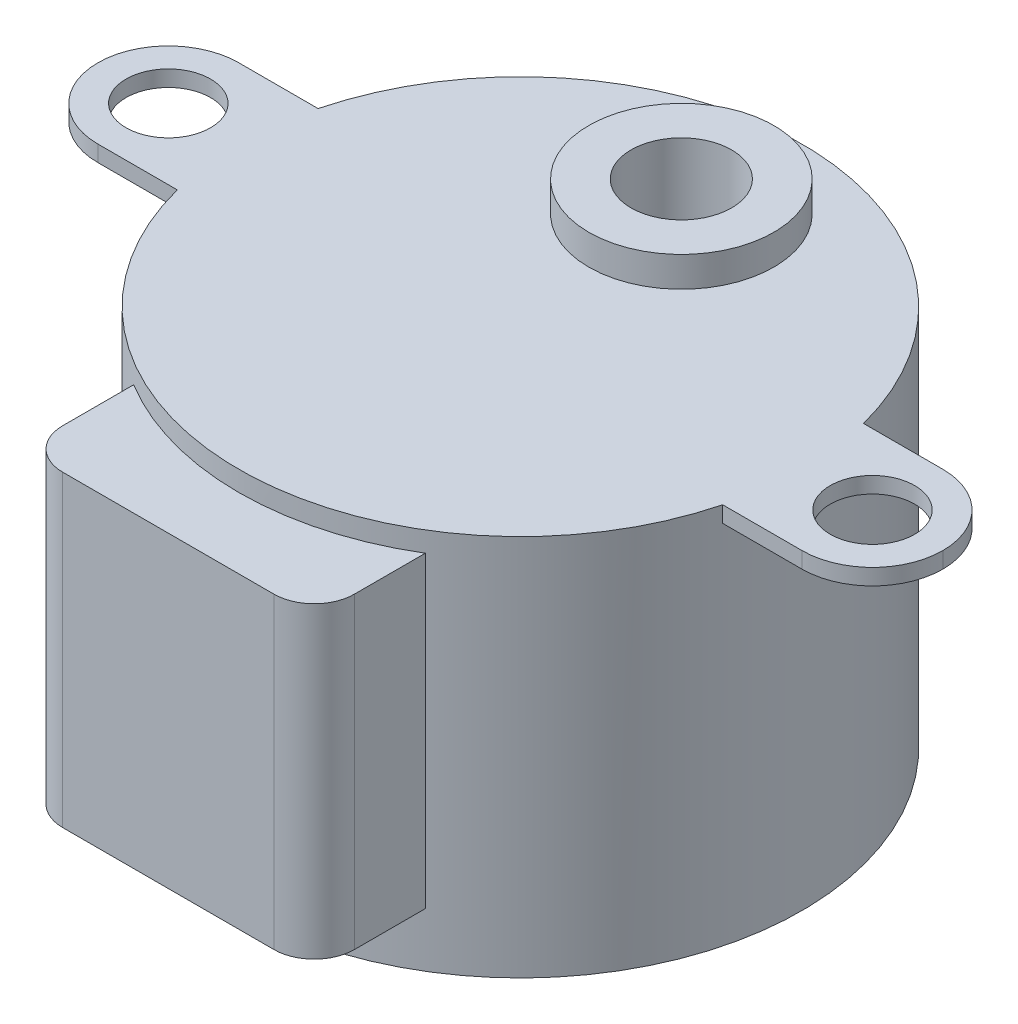
ISO-10303-21;
HEADER;
FILE_DESCRIPTION(('STEP AP214'),'2;1');
FILE_NAME('part.step','',(''),(''),'','','');
FILE_SCHEMA(('AUTOMOTIVE_DESIGN { 1 0 10303 214 1 1 1 1 }'));
ENDSEC;
DATA;
#1=APPLICATION_CONTEXT('core data for automotive mechanical design processes');
#2=APPLICATION_PROTOCOL_DEFINITION('international standard','automotive_design',2000,#1);
#3=PRODUCT_CONTEXT('',#1,'mechanical');
#4=PRODUCT('Part','Part','',(#3));
#5=PRODUCT_RELATED_PRODUCT_CATEGORY('part','',(#4));
#6=PRODUCT_DEFINITION_FORMATION('','',#4);
#7=PRODUCT_DEFINITION_CONTEXT('part definition',#1,'design');
#8=PRODUCT_DEFINITION('design','',#6,#7);
#9=PRODUCT_DEFINITION_SHAPE('','',#8);
#10=(LENGTH_UNIT() NAMED_UNIT(*) SI_UNIT(.MILLI.,.METRE.));
#11=(NAMED_UNIT(*) PLANE_ANGLE_UNIT() SI_UNIT($,.RADIAN.));
#12=(NAMED_UNIT(*) SI_UNIT($,.STERADIAN.) SOLID_ANGLE_UNIT());
#13=UNCERTAINTY_MEASURE_WITH_UNIT(LENGTH_MEASURE(1.E-05),#10,'distance_accuracy_value','');
#14=(GEOMETRIC_REPRESENTATION_CONTEXT(3) GLOBAL_UNCERTAINTY_ASSIGNED_CONTEXT((#13)) GLOBAL_UNIT_ASSIGNED_CONTEXT((#10,
#11,#12)) REPRESENTATION_CONTEXT('',''));
#15=CARTESIAN_POINT('',(0.,0.,0.));
#16=DIRECTION('',(0.,0.,1.));
#17=DIRECTION('',(1.,0.,0.));
#18=AXIS2_PLACEMENT_3D('',#15,#16,#17);
#19=CARTESIAN_POINT('',(-7.25,2.7,9.5));
#20=DIRECTION('',(-1.,0.,0.));
#21=DIRECTION('',(0.,0.,1.));
#22=AXIS2_PLACEMENT_3D('',#19,#20,#21);
#23=PLANE('',#22);
#24=DIRECTION('',(0.,1.,0.));
#25=VECTOR('',#24,1.);
#26=CARTESIAN_POINT('',(-7.25,2.7,15.5));
#27=LINE('',#26,#25);
#28=CARTESIAN_POINT('',(-7.25,2.7,15.5));
#29=VERTEX_POINT('',#28);
#30=CARTESIAN_POINT('',(-7.25,18.,15.5));
#31=VERTEX_POINT('',#30);
#32=EDGE_CURVE('E164',#29,#31,#27,.T.);
#33=ORIENTED_EDGE('',*,*,#32,.T.);
#34=DIRECTION('',(0.,0.,1.));
#35=VECTOR('',#34,1.);
#36=CARTESIAN_POINT('',(-7.25,18.,11.9765395670035));
#37=LINE('',#36,#35);
#38=CARTESIAN_POINT('',(-7.25,18.,11.9765395670035));
#39=VERTEX_POINT('',#38);
#40=EDGE_CURVE('E150',#39,#31,#37,.T.);
#41=ORIENTED_EDGE('',*,*,#40,.F.);
#42=DIRECTION('',(0.,-1.,0.));
#43=VECTOR('',#42,1.);
#44=CARTESIAN_POINT('',(-7.25,19.,11.9765395670035));
#45=LINE('',#44,#43);
#46=CARTESIAN_POINT('',(-7.25,2.7,11.9765395670035));
#47=VERTEX_POINT('',#46);
#48=EDGE_CURVE('E161',#47,#39,#45,.F.);
#49=ORIENTED_EDGE('',*,*,#48,.F.);
#50=DIRECTION('',(0.,0.,1.));
#51=VECTOR('',#50,1.);
#52=CARTESIAN_POINT('',(-7.25,2.7,9.5));
#53=LINE('',#52,#51);
#54=EDGE_CURVE('E269',#47,#29,#53,.T.);
#55=ORIENTED_EDGE('',*,*,#54,.T.);
#56=EDGE_LOOP('',(#33,#41,#49,#55));
#57=FACE_BOUND('',#56,.T.);
#58=ADVANCED_FACE('F36',(#57),#23,.T.);
#59=CARTESIAN_POINT('',(7.25,2.7,9.5));
#60=DIRECTION('',(1.,0.,0.));
#61=DIRECTION('',(0.,0.,-1.));
#62=AXIS2_PLACEMENT_3D('',#59,#60,#61);
#63=PLANE('',#62);
#64=DIRECTION('',(0.,-1.,0.));
#65=VECTOR('',#64,1.);
#66=CARTESIAN_POINT('',(7.25,19.,11.9765395670035));
#67=LINE('',#66,#65);
#68=CARTESIAN_POINT('',(7.25,18.,11.9765395670035));
#69=VERTEX_POINT('',#68);
#70=CARTESIAN_POINT('',(7.25,2.7,11.9765395670035));
#71=VERTEX_POINT('',#70);
#72=EDGE_CURVE('E172',#69,#71,#67,.T.);
#73=ORIENTED_EDGE('',*,*,#72,.F.);
#74=DIRECTION('',(0.,0.,-1.));
#75=VECTOR('',#74,1.);
#76=CARTESIAN_POINT('',(7.25,18.,22.1692249295966));
#77=LINE('',#76,#75);
#78=CARTESIAN_POINT('',(7.25,18.,15.5));
#79=VERTEX_POINT('',#78);
#80=EDGE_CURVE('E152',#79,#69,#77,.T.);
#81=ORIENTED_EDGE('',*,*,#80,.F.);
#82=DIRECTION('',(0.,1.,0.));
#83=VECTOR('',#82,1.);
#84=CARTESIAN_POINT('',(7.25,2.7,15.5));
#85=LINE('',#84,#83);
#86=CARTESIAN_POINT('',(7.25,2.7,15.5));
#87=VERTEX_POINT('',#86);
#88=EDGE_CURVE('E44',#79,#87,#85,.F.);
#89=ORIENTED_EDGE('',*,*,#88,.T.);
#90=DIRECTION('',(0.,0.,-1.));
#91=VECTOR('',#90,1.);
#92=CARTESIAN_POINT('',(7.25,2.7,9.5));
#93=LINE('',#92,#91);
#94=EDGE_CURVE('E177',#87,#71,#93,.T.);
#95=ORIENTED_EDGE('',*,*,#94,.T.);
#96=EDGE_LOOP('',(#73,#81,#89,#95));
#97=FACE_BOUND('',#96,.T.);
#98=ADVANCED_FACE('F287',(#97),#63,.T.);
#99=CARTESIAN_POINT('',(-7.25,2.7,17.5));
#100=DIRECTION('',(0.,0.,1.));
#101=DIRECTION('',(1.,0.,0.));
#102=AXIS2_PLACEMENT_3D('',#99,#100,#101);
#103=PLANE('',#102);
#104=DIRECTION('',(0.,1.,0.));
#105=VECTOR('',#104,1.);
#106=CARTESIAN_POINT('',(5.25,2.7,17.5));
#107=LINE('',#106,#105);
#108=CARTESIAN_POINT('',(5.25,2.7,17.5));
#109=VERTEX_POINT('',#108);
#110=CARTESIAN_POINT('',(5.25,18.,17.5));
#111=VERTEX_POINT('',#110);
#112=EDGE_CURVE('E257',#109,#111,#107,.T.);
#113=ORIENTED_EDGE('',*,*,#112,.T.);
#114=DIRECTION('',(-1.,0.,0.));
#115=VECTOR('',#114,1.);
#116=CARTESIAN_POINT('',(-7.25,18.,17.5));
#117=LINE('',#116,#115);
#118=CARTESIAN_POINT('',(-5.25,18.,17.5));
#119=VERTEX_POINT('',#118);
#120=EDGE_CURVE('E51',#111,#119,#117,.T.);
#121=ORIENTED_EDGE('',*,*,#120,.T.);
#122=DIRECTION('',(0.,1.,0.));
#123=VECTOR('',#122,1.);
#124=CARTESIAN_POINT('',(-5.25,2.7,17.5));
#125=LINE('',#124,#123);
#126=CARTESIAN_POINT('',(-5.25,2.7,17.5));
#127=VERTEX_POINT('',#126);
#128=EDGE_CURVE('E260',#119,#127,#125,.F.);
#129=ORIENTED_EDGE('',*,*,#128,.T.);
#130=DIRECTION('',(1.,0.,0.));
#131=VECTOR('',#130,1.);
#132=CARTESIAN_POINT('',(-7.25,2.7,17.5));
#133=LINE('',#132,#131);
#134=EDGE_CURVE('E271',#127,#109,#133,.T.);
#135=ORIENTED_EDGE('',*,*,#134,.T.);
#136=EDGE_LOOP('',(#113,#121,#129,#135));
#137=FACE_BOUND('',#136,.T.);
#138=ADVANCED_FACE('F292',(#137),#103,.T.);
#139=CARTESIAN_POINT('',(-5.25,2.7,15.5));
#140=DIRECTION('',(0.,1.,0.));
#141=DIRECTION('',(0.,0.,1.));
#142=AXIS2_PLACEMENT_3D('',#139,#140,#141);
#143=CYLINDRICAL_SURFACE('',#142,2.);
#144=ORIENTED_EDGE('',*,*,#128,.F.);
#145=CARTESIAN_POINT('',(-5.25,18.,15.5));
#146=DIRECTION('',(0.,1.,0.));
#147=DIRECTION('',(0.,0.,1.));
#148=AXIS2_PLACEMENT_3D('',#145,#146,#147);
#149=CIRCLE('',#148,2.);
#150=EDGE_CURVE('E277',#119,#31,#149,.F.);
#151=ORIENTED_EDGE('',*,*,#150,.T.);
#152=ORIENTED_EDGE('',*,*,#32,.F.);
#153=CARTESIAN_POINT('',(-5.25,2.7,15.5));
#154=DIRECTION('',(0.,1.,0.));
#155=DIRECTION('',(0.,0.,1.));
#156=AXIS2_PLACEMENT_3D('',#153,#154,#155);
#157=CIRCLE('',#156,2.);
#158=EDGE_CURVE('E264',#127,#29,#157,.F.);
#159=ORIENTED_EDGE('',*,*,#158,.F.);
#160=EDGE_LOOP('',(#144,#151,#152,#159));
#161=FACE_BOUND('',#160,.T.);
#162=ADVANCED_FACE('F276',(#161),#143,.T.);
#163=CARTESIAN_POINT('',(5.25,2.7,15.5));
#164=DIRECTION('',(0.,1.,0.));
#165=DIRECTION('',(0.,0.,1.));
#166=AXIS2_PLACEMENT_3D('',#163,#164,#165);
#167=CYLINDRICAL_SURFACE('',#166,2.);
#168=ORIENTED_EDGE('',*,*,#88,.F.);
#169=CARTESIAN_POINT('',(5.25,18.,15.5));
#170=DIRECTION('',(0.,1.,0.));
#171=DIRECTION('',(0.,0.,1.));
#172=AXIS2_PLACEMENT_3D('',#169,#170,#171);
#173=CIRCLE('',#172,2.);
#174=EDGE_CURVE('E11',#79,#111,#173,.F.);
#175=ORIENTED_EDGE('',*,*,#174,.T.);
#176=ORIENTED_EDGE('',*,*,#112,.F.);
#177=CARTESIAN_POINT('',(5.25,2.7,15.5));
#178=DIRECTION('',(0.,1.,0.));
#179=DIRECTION('',(0.,0.,1.));
#180=AXIS2_PLACEMENT_3D('',#177,#178,#179);
#181=CIRCLE('',#180,2.);
#182=EDGE_CURVE('E262',#87,#109,#181,.F.);
#183=ORIENTED_EDGE('',*,*,#182,.F.);
#184=EDGE_LOOP('',(#168,#175,#176,#183));
#185=FACE_BOUND('',#184,.T.);
#186=ADVANCED_FACE('F38',(#185),#167,.T.);
#187=CARTESIAN_POINT('',(0.,20.5,-8.));
#188=DIRECTION('',(0.,1.,0.));
#189=DIRECTION('',(0.,0.,1.));
#190=AXIS2_PLACEMENT_3D('',#187,#188,#189);
#191=PLANE('',#190);
#192=CARTESIAN_POINT('',(0.,20.5,-8.));
#193=DIRECTION('',(0.,1.,0.));
#194=DIRECTION('',(0.,0.,1.));
#195=AXIS2_PLACEMENT_3D('',#192,#193,#194);
#196=CIRCLE('',#195,4.6);
#197=CARTESIAN_POINT('',(0.,20.5,-3.4));
#198=VERTEX_POINT('',#197);
#199=EDGE_CURVE('E274',#198,#198,#196,.T.);
#200=ORIENTED_EDGE('',*,*,#199,.T.);
#201=EDGE_LOOP('',(#200));
#202=FACE_BOUND('',#201,.T.);
#203=CARTESIAN_POINT('',(0.,20.5,-8.));
#204=DIRECTION('',(0.,1.,0.));
#205=DIRECTION('',(0.,0.,1.));
#206=AXIS2_PLACEMENT_3D('',#203,#204,#205);
#207=CIRCLE('',#206,2.5);
#208=CARTESIAN_POINT('',(0.,20.5,-5.5));
#209=VERTEX_POINT('',#208);
#210=EDGE_CURVE('E156',#209,#209,#207,.T.);
#211=ORIENTED_EDGE('',*,*,#210,.F.);
#212=EDGE_LOOP('',(#211));
#213=FACE_BOUND('',#212,.T.);
#214=ADVANCED_FACE('F334',(#202,#213),#191,.T.);
#215=CARTESIAN_POINT('',(0.,19.,0.));
#216=DIRECTION('',(0.,1.,0.));
#217=DIRECTION('',(0.,0.,1.));
#218=AXIS2_PLACEMENT_3D('',#215,#216,#217);
#219=PLANE('',#218);
#220=CARTESIAN_POINT('',(0.,19.,0.));
#221=DIRECTION('',(0.,1.,0.));
#222=DIRECTION('',(0.,0.,1.));
#223=AXIS2_PLACEMENT_3D('',#220,#221,#222);
#224=CIRCLE('',#223,14.);
#225=CARTESIAN_POINT('',(-13.555441711726,19.,3.5));
#226=VERTEX_POINT('',#225);
#227=CARTESIAN_POINT('',(13.5554417117259,19.,3.5));
#228=VERTEX_POINT('',#227);
#229=EDGE_CURVE('E218',#226,#228,#224,.T.);
#230=ORIENTED_EDGE('',*,*,#229,.T.);
#231=DIRECTION('',(1.,0.,0.));
#232=VECTOR('',#231,1.);
#233=CARTESIAN_POINT('',(-21.,19.,3.5));
#234=LINE('',#233,#232);
#235=CARTESIAN_POINT('',(17.5,19.,3.5));
#236=VERTEX_POINT('',#235);
#237=EDGE_CURVE('E191',#228,#236,#234,.T.);
#238=ORIENTED_EDGE('',*,*,#237,.T.);
#239=CARTESIAN_POINT('',(17.5,19.,0.));
#240=DIRECTION('',(0.,1.,0.));
#241=DIRECTION('',(0.,0.,1.));
#242=AXIS2_PLACEMENT_3D('',#239,#240,#241);
#243=CIRCLE('',#242,3.5);
#244=CARTESIAN_POINT('',(21.,19.,0.));
#245=VERTEX_POINT('',#244);
#246=EDGE_CURVE('E236',#236,#245,#243,.T.);
#247=ORIENTED_EDGE('',*,*,#246,.T.);
#248=CARTESIAN_POINT('',(17.5,19.,0.));
#249=DIRECTION('',(0.,1.,0.));
#250=DIRECTION('',(0.,0.,1.));
#251=AXIS2_PLACEMENT_3D('',#248,#249,#250);
#252=CIRCLE('',#251,3.5);
#253=CARTESIAN_POINT('',(17.5,19.,-3.5));
#254=VERTEX_POINT('',#253);
#255=EDGE_CURVE('E234',#245,#254,#252,.T.);
#256=ORIENTED_EDGE('',*,*,#255,.T.);
#257=DIRECTION('',(-1.,0.,0.));
#258=VECTOR('',#257,1.);
#259=CARTESIAN_POINT('',(-21.,19.,-3.5));
#260=LINE('',#259,#258);
#261=CARTESIAN_POINT('',(13.555441711726,19.,-3.5));
#262=VERTEX_POINT('',#261);
#263=EDGE_CURVE('E204',#254,#262,#260,.T.);
#264=ORIENTED_EDGE('',*,*,#263,.T.);
#265=CARTESIAN_POINT('',(-13.555441711726,19.,-3.5));
#266=VERTEX_POINT('',#265);
#267=EDGE_CURVE('E220',#262,#266,#224,.T.);
#268=ORIENTED_EDGE('',*,*,#267,.T.);
#269=CARTESIAN_POINT('',(-17.5,19.,-3.5));
#270=VERTEX_POINT('',#269);
#271=EDGE_CURVE('E203',#266,#270,#260,.T.);
#272=ORIENTED_EDGE('',*,*,#271,.T.);
#273=CARTESIAN_POINT('',(-17.5,19.,0.));
#274=DIRECTION('',(0.,1.,0.));
#275=DIRECTION('',(0.,0.,1.));
#276=AXIS2_PLACEMENT_3D('',#273,#274,#275);
#277=CIRCLE('',#276,3.5);
#278=CARTESIAN_POINT('',(-21.,19.,0.));
#279=VERTEX_POINT('',#278);
#280=EDGE_CURVE('E230',#270,#279,#277,.T.);
#281=ORIENTED_EDGE('',*,*,#280,.T.);
#282=CARTESIAN_POINT('',(-17.5,19.,0.));
#283=DIRECTION('',(0.,1.,0.));
#284=DIRECTION('',(0.,0.,1.));
#285=AXIS2_PLACEMENT_3D('',#282,#283,#284);
#286=CIRCLE('',#285,3.5);
#287=CARTESIAN_POINT('',(-17.5,19.,3.5));
#288=VERTEX_POINT('',#287);
#289=EDGE_CURVE('E232',#279,#288,#286,.T.);
#290=ORIENTED_EDGE('',*,*,#289,.T.);
#291=EDGE_CURVE('E201',#288,#226,#234,.T.);
#292=ORIENTED_EDGE('',*,*,#291,.T.);
#293=EDGE_LOOP('',(#230,#238,#247,#256,#264,#268,#272,#281,#290,#292));
#294=FACE_BOUND('',#293,.T.);
#295=CARTESIAN_POINT('',(17.5,19.,0.));
#296=DIRECTION('',(0.,1.,0.));
#297=DIRECTION('',(0.,0.,1.));
#298=AXIS2_PLACEMENT_3D('',#295,#296,#297);
#299=CIRCLE('',#298,2.1);
#300=CARTESIAN_POINT('',(17.5,19.,2.1));
#301=VERTEX_POINT('',#300);
#302=EDGE_CURVE('E185',#301,#301,#299,.T.);
#303=ORIENTED_EDGE('',*,*,#302,.F.);
#304=EDGE_LOOP('',(#303));
#305=FACE_BOUND('',#304,.T.);
#306=CARTESIAN_POINT('',(-17.5,19.,0.));
#307=DIRECTION('',(0.,1.,0.));
#308=DIRECTION('',(0.,0.,1.));
#309=AXIS2_PLACEMENT_3D('',#306,#307,#308);
#310=CIRCLE('',#309,2.1);
#311=CARTESIAN_POINT('',(-17.5,19.,2.1));
#312=VERTEX_POINT('',#311);
#313=EDGE_CURVE('E184',#312,#312,#310,.T.);
#314=ORIENTED_EDGE('',*,*,#313,.F.);
#315=EDGE_LOOP('',(#314));
#316=FACE_BOUND('',#315,.T.);
#317=CARTESIAN_POINT('',(0.,19.,-8.));
#318=DIRECTION('',(0.,1.,0.));
#319=DIRECTION('',(0.,0.,1.));
#320=AXIS2_PLACEMENT_3D('',#317,#318,#319);
#321=CIRCLE('',#320,4.6);
#322=CARTESIAN_POINT('',(0.,19.,-3.4));
#323=VERTEX_POINT('',#322);
#324=EDGE_CURVE('E278',#323,#323,#321,.T.);
#325=ORIENTED_EDGE('',*,*,#324,.F.);
#326=EDGE_LOOP('',(#325));
#327=FACE_BOUND('',#326,.T.);
#328=ADVANCED_FACE('F331',(#294,#305,#316,#327),#219,.T.);
#329=CARTESIAN_POINT('',(0.,19.,0.));
#330=DIRECTION('',(0.,-1.,0.));
#331=DIRECTION('',(0.,0.,-1.));
#332=AXIS2_PLACEMENT_3D('',#329,#330,#331);
#333=CYLINDRICAL_SURFACE('',#332,14.);
#334=DIRECTION('',(0.,-1.,0.));
#335=VECTOR('',#334,1.);
#336=CARTESIAN_POINT('',(13.555441711726,19.,3.5));
#337=LINE('',#336,#335);
#338=CARTESIAN_POINT('',(13.555441711726,18.2,3.5));
#339=VERTEX_POINT('',#338);
#340=EDGE_CURVE('E200',#339,#228,#337,.F.);
#341=ORIENTED_EDGE('',*,*,#340,.T.);
#342=ORIENTED_EDGE('',*,*,#229,.F.);
#343=DIRECTION('',(0.,-1.,0.));
#344=VECTOR('',#343,1.);
#345=CARTESIAN_POINT('',(-13.555441711726,19.,3.5));
#346=LINE('',#345,#344);
#347=CARTESIAN_POINT('',(-13.555441711726,18.2,3.5));
#348=VERTEX_POINT('',#347);
#349=EDGE_CURVE('E208',#226,#348,#346,.T.);
#350=ORIENTED_EDGE('',*,*,#349,.T.);
#351=CARTESIAN_POINT('',(0.,18.2,0.));
#352=DIRECTION('',(0.,1.,0.));
#353=DIRECTION('',(0.,0.,1.));
#354=AXIS2_PLACEMENT_3D('',#351,#352,#353);
#355=CIRCLE('',#354,14.);
#356=CARTESIAN_POINT('',(-13.555441711726,18.2,-3.5));
#357=VERTEX_POINT('',#356);
#358=EDGE_CURVE('E223',#357,#348,#355,.T.);
#359=ORIENTED_EDGE('',*,*,#358,.F.);
#360=DIRECTION('',(0.,-1.,0.));
#361=VECTOR('',#360,1.);
#362=CARTESIAN_POINT('',(-13.555441711726,19.,-3.5));
#363=LINE('',#362,#361);
#364=EDGE_CURVE('E211',#357,#266,#363,.F.);
#365=ORIENTED_EDGE('',*,*,#364,.T.);
#366=ORIENTED_EDGE('',*,*,#267,.F.);
#367=DIRECTION('',(0.,-1.,0.));
#368=VECTOR('',#367,1.);
#369=CARTESIAN_POINT('',(13.555441711726,19.,-3.5));
#370=LINE('',#369,#368);
#371=CARTESIAN_POINT('',(13.555441711726,18.2,-3.5));
#372=VERTEX_POINT('',#371);
#373=EDGE_CURVE('E214',#262,#372,#370,.T.);
#374=ORIENTED_EDGE('',*,*,#373,.T.);
#375=EDGE_CURVE('E226',#339,#372,#355,.T.);
#376=ORIENTED_EDGE('',*,*,#375,.F.);
#377=EDGE_LOOP('',(#341,#342,#350,#359,#365,#366,#374,#376));
#378=FACE_BOUND('',#377,.T.);
#379=CARTESIAN_POINT('',(0.,2.7,0.));
#380=DIRECTION('',(0.,1.,0.));
#381=DIRECTION('',(0.,0.,1.));
#382=AXIS2_PLACEMENT_3D('',#379,#380,#381);
#383=CIRCLE('',#382,14.);
#384=EDGE_CURVE('E170',#47,#71,#383,.T.);
#385=ORIENTED_EDGE('',*,*,#384,.F.);
#386=ORIENTED_EDGE('',*,*,#48,.T.);
#387=CARTESIAN_POINT('',(0.,18.,0.));
#388=DIRECTION('',(0.,-1.,0.));
#389=DIRECTION('',(0.,0.,1.));
#390=AXIS2_PLACEMENT_3D('',#387,#388,#389);
#391=CIRCLE('',#390,14.);
#392=EDGE_CURVE('E147',#69,#39,#391,.T.);
#393=ORIENTED_EDGE('',*,*,#392,.F.);
#394=ORIENTED_EDGE('',*,*,#72,.T.);
#395=EDGE_LOOP('',(#385,#386,#393,#394));
#396=FACE_BOUND('',#395,.T.);
#397=CARTESIAN_POINT('',(0.,0.,0.));
#398=DIRECTION('',(0.,1.,0.));
#399=DIRECTION('',(0.,0.,1.));
#400=AXIS2_PLACEMENT_3D('',#397,#398,#399);
#401=CIRCLE('',#400,14.);
#402=CARTESIAN_POINT('',(0.,0.,14.));
#403=VERTEX_POINT('',#402);
#404=EDGE_CURVE('E217',#403,#403,#401,.T.);
#405=ORIENTED_EDGE('',*,*,#404,.T.);
#406=EDGE_LOOP('',(#405));
#407=FACE_BOUND('',#406,.T.);
#408=ADVANCED_FACE('F167',(#378,#396,#407),#333,.T.);
#409=CARTESIAN_POINT('',(0.,0.,0.));
#410=DIRECTION('',(0.,1.,0.));
#411=DIRECTION('',(0.,0.,1.));
#412=AXIS2_PLACEMENT_3D('',#409,#410,#411);
#413=PLANE('',#412);
#414=ORIENTED_EDGE('',*,*,#404,.F.);
#415=EDGE_LOOP('',(#414));
#416=FACE_BOUND('',#415,.T.);
#417=ADVANCED_FACE('F316',(#416),#413,.F.);
#418=CARTESIAN_POINT('',(-17.5,18.2,0.));
#419=DIRECTION('',(0.,1.,0.));
#420=DIRECTION('',(0.,0.,1.));
#421=AXIS2_PLACEMENT_3D('',#418,#419,#420);
#422=CYLINDRICAL_SURFACE('',#421,2.1);
#423=CARTESIAN_POINT('',(-17.5,18.2,0.));
#424=DIRECTION('',(0.,1.,0.));
#425=DIRECTION('',(0.,0.,1.));
#426=AXIS2_PLACEMENT_3D('',#423,#424,#425);
#427=CIRCLE('',#426,2.1);
#428=CARTESIAN_POINT('',(-17.5,18.2,2.1));
#429=VERTEX_POINT('',#428);
#430=EDGE_CURVE('E188',#429,#429,#427,.T.);
#431=ORIENTED_EDGE('',*,*,#430,.F.);
#432=EDGE_LOOP('',(#431));
#433=FACE_BOUND('',#432,.T.);
#434=ORIENTED_EDGE('',*,*,#313,.T.);
#435=EDGE_LOOP('',(#434));
#436=FACE_BOUND('',#435,.T.);
#437=ADVANCED_FACE('F312',(#433,#436),#422,.F.);
#438=CARTESIAN_POINT('',(0.,18.2,0.));
#439=DIRECTION('',(0.,1.,0.));
#440=DIRECTION('',(0.,0.,1.));
#441=AXIS2_PLACEMENT_3D('',#438,#439,#440);
#442=PLANE('',#441);
#443=ORIENTED_EDGE('',*,*,#430,.T.);
#444=EDGE_LOOP('',(#443));
#445=FACE_BOUND('',#444,.T.);
#446=DIRECTION('',(1.,0.,0.));
#447=VECTOR('',#446,1.);
#448=CARTESIAN_POINT('',(-21.,18.2,3.5));
#449=LINE('',#448,#447);
#450=CARTESIAN_POINT('',(-17.5,18.2,3.5));
#451=VERTEX_POINT('',#450);
#452=EDGE_CURVE('E194',#451,#348,#449,.T.);
#453=ORIENTED_EDGE('',*,*,#452,.F.);
#454=CARTESIAN_POINT('',(-17.5,18.2,0.));
#455=DIRECTION('',(0.,1.,0.));
#456=DIRECTION('',(0.,0.,1.));
#457=AXIS2_PLACEMENT_3D('',#454,#455,#456);
#458=CIRCLE('',#457,3.5);
#459=CARTESIAN_POINT('',(-21.,18.2,0.));
#460=VERTEX_POINT('',#459);
#461=EDGE_CURVE('E249',#451,#460,#458,.F.);
#462=ORIENTED_EDGE('',*,*,#461,.T.);
#463=CARTESIAN_POINT('',(-17.5,18.2,0.));
#464=DIRECTION('',(0.,1.,0.));
#465=DIRECTION('',(0.,0.,1.));
#466=AXIS2_PLACEMENT_3D('',#463,#464,#465);
#467=CIRCLE('',#466,3.5);
#468=CARTESIAN_POINT('',(-17.5,18.2,-3.5));
#469=VERTEX_POINT('',#468);
#470=EDGE_CURVE('E247',#460,#469,#467,.F.);
#471=ORIENTED_EDGE('',*,*,#470,.T.);
#472=DIRECTION('',(-1.,0.,0.));
#473=VECTOR('',#472,1.);
#474=CARTESIAN_POINT('',(-21.,18.2,-3.5));
#475=LINE('',#474,#473);
#476=EDGE_CURVE('E196',#357,#469,#475,.T.);
#477=ORIENTED_EDGE('',*,*,#476,.F.);
#478=ORIENTED_EDGE('',*,*,#358,.T.);
#479=EDGE_LOOP('',(#453,#462,#471,#477,#478));
#480=FACE_BOUND('',#479,.T.);
#481=ADVANCED_FACE('F315',(#445,#480),#442,.F.);
#482=CARTESIAN_POINT('',(-21.,18.2,3.5));
#483=DIRECTION('',(0.,0.,1.));
#484=DIRECTION('',(1.,0.,0.));
#485=AXIS2_PLACEMENT_3D('',#482,#483,#484);
#486=PLANE('',#485);
#487=ORIENTED_EDGE('',*,*,#291,.F.);
#488=DIRECTION('',(0.,1.,0.));
#489=VECTOR('',#488,1.);
#490=CARTESIAN_POINT('',(-17.5,18.2,3.5));
#491=LINE('',#490,#489);
#492=EDGE_CURVE('E244',#288,#451,#491,.F.);
#493=ORIENTED_EDGE('',*,*,#492,.T.);
#494=ORIENTED_EDGE('',*,*,#452,.T.);
#495=ORIENTED_EDGE('',*,*,#349,.F.);
#496=EDGE_LOOP('',(#487,#493,#494,#495));
#497=FACE_BOUND('',#496,.T.);
#498=ADVANCED_FACE('F327',(#497),#486,.T.);
#499=CARTESIAN_POINT('',(-21.,18.2,-3.5));
#500=DIRECTION('',(0.,0.,-1.));
#501=DIRECTION('',(-1.,0.,0.));
#502=AXIS2_PLACEMENT_3D('',#499,#500,#501);
#503=PLANE('',#502);
#504=ORIENTED_EDGE('',*,*,#476,.T.);
#505=DIRECTION('',(0.,1.,0.));
#506=VECTOR('',#505,1.);
#507=CARTESIAN_POINT('',(-17.5,18.2,-3.5));
#508=LINE('',#507,#506);
#509=EDGE_CURVE('E251',#469,#270,#508,.T.);
#510=ORIENTED_EDGE('',*,*,#509,.T.);
#511=ORIENTED_EDGE('',*,*,#271,.F.);
#512=ORIENTED_EDGE('',*,*,#364,.F.);
#513=EDGE_LOOP('',(#504,#510,#511,#512));
#514=FACE_BOUND('',#513,.T.);
#515=ADVANCED_FACE('F322',(#514),#503,.T.);
#516=CARTESIAN_POINT('',(17.5,18.2,0.));
#517=DIRECTION('',(0.,1.,0.));
#518=DIRECTION('',(0.,0.,1.));
#519=AXIS2_PLACEMENT_3D('',#516,#517,#518);
#520=CIRCLE('',#519,2.1);
#521=CARTESIAN_POINT('',(17.5,18.2,2.1));
#522=VERTEX_POINT('',#521);
#523=EDGE_CURVE('E181',#522,#522,#520,.T.);
#524=ORIENTED_EDGE('',*,*,#523,.T.);
#525=EDGE_LOOP('',(#524));
#526=FACE_BOUND('',#525,.T.);
#527=CARTESIAN_POINT('',(17.5,18.2,0.));
#528=DIRECTION('',(0.,1.,0.));
#529=DIRECTION('',(0.,0.,1.));
#530=AXIS2_PLACEMENT_3D('',#527,#528,#529);
#531=CIRCLE('',#530,3.5);
#532=CARTESIAN_POINT('',(17.5,18.2,-3.5));
#533=VERTEX_POINT('',#532);
#534=CARTESIAN_POINT('',(21.,18.2,0.));
#535=VERTEX_POINT('',#534);
#536=EDGE_CURVE('E238',#533,#535,#531,.F.);
#537=ORIENTED_EDGE('',*,*,#536,.T.);
#538=CARTESIAN_POINT('',(17.5,18.2,0.));
#539=DIRECTION('',(0.,1.,0.));
#540=DIRECTION('',(0.,0.,1.));
#541=AXIS2_PLACEMENT_3D('',#538,#539,#540);
#542=CIRCLE('',#541,3.5);
#543=CARTESIAN_POINT('',(17.5,18.2,3.5));
#544=VERTEX_POINT('',#543);
#545=EDGE_CURVE('E240',#535,#544,#542,.F.);
#546=ORIENTED_EDGE('',*,*,#545,.T.);
#547=EDGE_CURVE('E197',#339,#544,#449,.T.);
#548=ORIENTED_EDGE('',*,*,#547,.F.);
#549=ORIENTED_EDGE('',*,*,#375,.T.);
#550=EDGE_CURVE('E198',#533,#372,#475,.T.);
#551=ORIENTED_EDGE('',*,*,#550,.F.);
#552=EDGE_LOOP('',(#537,#546,#548,#549,#551));
#553=FACE_BOUND('',#552,.T.);
#554=ADVANCED_FACE('F318',(#526,#553),#442,.F.);
#555=ORIENTED_EDGE('',*,*,#263,.F.);
#556=DIRECTION('',(0.,1.,0.));
#557=VECTOR('',#556,1.);
#558=CARTESIAN_POINT('',(17.5,18.2,-3.5));
#559=LINE('',#558,#557);
#560=EDGE_CURVE('E242',#254,#533,#559,.F.);
#561=ORIENTED_EDGE('',*,*,#560,.T.);
#562=ORIENTED_EDGE('',*,*,#550,.T.);
#563=ORIENTED_EDGE('',*,*,#373,.F.);
#564=EDGE_LOOP('',(#555,#561,#562,#563));
#565=FACE_BOUND('',#564,.T.);
#566=ADVANCED_FACE('F321',(#565),#503,.T.);
#567=ORIENTED_EDGE('',*,*,#547,.T.);
#568=DIRECTION('',(0.,1.,0.));
#569=VECTOR('',#568,1.);
#570=CARTESIAN_POINT('',(17.5,18.2,3.5));
#571=LINE('',#570,#569);
#572=EDGE_CURVE('E227',#544,#236,#571,.T.);
#573=ORIENTED_EDGE('',*,*,#572,.T.);
#574=ORIENTED_EDGE('',*,*,#237,.F.);
#575=ORIENTED_EDGE('',*,*,#340,.F.);
#576=EDGE_LOOP('',(#567,#573,#574,#575));
#577=FACE_BOUND('',#576,.T.);
#578=ADVANCED_FACE('F310',(#577),#486,.T.);
#579=CARTESIAN_POINT('',(17.5,18.2,0.));
#580=DIRECTION('',(0.,1.,0.));
#581=DIRECTION('',(0.,0.,1.));
#582=AXIS2_PLACEMENT_3D('',#579,#580,#581);
#583=CYLINDRICAL_SURFACE('',#582,2.1);
#584=ORIENTED_EDGE('',*,*,#523,.F.);
#585=EDGE_LOOP('',(#584));
#586=FACE_BOUND('',#585,.T.);
#587=ORIENTED_EDGE('',*,*,#302,.T.);
#588=EDGE_LOOP('',(#587));
#589=FACE_BOUND('',#588,.T.);
#590=ADVANCED_FACE('F306',(#586,#589),#583,.F.);
#591=CARTESIAN_POINT('',(17.5,18.2,0.));
#592=DIRECTION('',(0.,1.,0.));
#593=DIRECTION('',(0.,0.,1.));
#594=AXIS2_PLACEMENT_3D('',#591,#592,#593);
#595=CYLINDRICAL_SURFACE('',#594,3.5);
#596=DIRECTION('',(0.,1.,0.));
#597=VECTOR('',#596,1.);
#598=CARTESIAN_POINT('',(21.,18.2,0.));
#599=LINE('',#598,#597);
#600=EDGE_CURVE('E175',#535,#245,#599,.T.);
#601=ORIENTED_EDGE('',*,*,#600,.F.);
#602=ORIENTED_EDGE('',*,*,#536,.F.);
#603=ORIENTED_EDGE('',*,*,#560,.F.);
#604=ORIENTED_EDGE('',*,*,#255,.F.);
#605=EDGE_LOOP('',(#601,#602,#603,#604));
#606=FACE_BOUND('',#605,.T.);
#607=ADVANCED_FACE('F309',(#606),#595,.T.);
#608=CARTESIAN_POINT('',(17.5,18.2,0.));
#609=DIRECTION('',(0.,1.,0.));
#610=DIRECTION('',(0.,0.,1.));
#611=AXIS2_PLACEMENT_3D('',#608,#609,#610);
#612=CYLINDRICAL_SURFACE('',#611,3.5);
#613=ORIENTED_EDGE('',*,*,#545,.F.);
#614=ORIENTED_EDGE('',*,*,#600,.T.);
#615=ORIENTED_EDGE('',*,*,#246,.F.);
#616=ORIENTED_EDGE('',*,*,#572,.F.);
#617=EDGE_LOOP('',(#613,#614,#615,#616));
#618=FACE_BOUND('',#617,.T.);
#619=ADVANCED_FACE('F342',(#618),#612,.T.);
#620=CARTESIAN_POINT('',(-17.5,18.2,0.));
#621=DIRECTION('',(0.,1.,0.));
#622=DIRECTION('',(0.,0.,1.));
#623=AXIS2_PLACEMENT_3D('',#620,#621,#622);
#624=CYLINDRICAL_SURFACE('',#623,3.5);
#625=ORIENTED_EDGE('',*,*,#509,.F.);
#626=ORIENTED_EDGE('',*,*,#470,.F.);
#627=DIRECTION('',(0.,1.,0.));
#628=VECTOR('',#627,1.);
#629=CARTESIAN_POINT('',(-21.,18.2,0.));
#630=LINE('',#629,#628);
#631=EDGE_CURVE('E171',#279,#460,#630,.F.);
#632=ORIENTED_EDGE('',*,*,#631,.F.);
#633=ORIENTED_EDGE('',*,*,#280,.F.);
#634=EDGE_LOOP('',(#625,#626,#632,#633));
#635=FACE_BOUND('',#634,.T.);
#636=ADVANCED_FACE('F345',(#635),#624,.T.);
#637=CARTESIAN_POINT('',(-17.5,18.2,0.));
#638=DIRECTION('',(0.,1.,0.));
#639=DIRECTION('',(0.,0.,1.));
#640=AXIS2_PLACEMENT_3D('',#637,#638,#639);
#641=CYLINDRICAL_SURFACE('',#640,3.5);
#642=ORIENTED_EDGE('',*,*,#461,.F.);
#643=ORIENTED_EDGE('',*,*,#492,.F.);
#644=ORIENTED_EDGE('',*,*,#289,.F.);
#645=ORIENTED_EDGE('',*,*,#631,.T.);
#646=EDGE_LOOP('',(#642,#643,#644,#645));
#647=FACE_BOUND('',#646,.T.);
#648=ADVANCED_FACE('F350',(#647),#641,.T.);
#649=CARTESIAN_POINT('',(0.,2.7,0.));
#650=DIRECTION('',(0.,1.,0.));
#651=DIRECTION('',(0.,0.,1.));
#652=AXIS2_PLACEMENT_3D('',#649,#650,#651);
#653=PLANE('',#652);
#654=ORIENTED_EDGE('',*,*,#134,.F.);
#655=ORIENTED_EDGE('',*,*,#158,.T.);
#656=ORIENTED_EDGE('',*,*,#54,.F.);
#657=ORIENTED_EDGE('',*,*,#384,.T.);
#658=ORIENTED_EDGE('',*,*,#94,.F.);
#659=ORIENTED_EDGE('',*,*,#182,.T.);
#660=EDGE_LOOP('',(#654,#655,#656,#657,#658,#659));
#661=FACE_BOUND('',#660,.T.);
#662=ADVANCED_FACE('F268',(#661),#653,.F.);
#663=CARTESIAN_POINT('',(0.,20.5,-8.));
#664=DIRECTION('',(0.,-1.,0.));
#665=DIRECTION('',(0.,0.,-1.));
#666=AXIS2_PLACEMENT_3D('',#663,#664,#665);
#667=CYLINDRICAL_SURFACE('',#666,4.6);
#668=ORIENTED_EDGE('',*,*,#199,.F.);
#669=EDGE_LOOP('',(#668));
#670=FACE_BOUND('',#669,.T.);
#671=ORIENTED_EDGE('',*,*,#324,.T.);
#672=EDGE_LOOP('',(#671));
#673=FACE_BOUND('',#672,.T.);
#674=ADVANCED_FACE('F432',(#670,#673),#667,.T.);
#675=CARTESIAN_POINT('',(0.,18.,0.));
#676=DIRECTION('',(0.,1.,0.));
#677=DIRECTION('',(0.,0.,1.));
#678=AXIS2_PLACEMENT_3D('',#675,#676,#677);
#679=PLANE('',#678);
#680=ORIENTED_EDGE('',*,*,#120,.F.);
#681=ORIENTED_EDGE('',*,*,#174,.F.);
#682=ORIENTED_EDGE('',*,*,#80,.T.);
#683=ORIENTED_EDGE('',*,*,#392,.T.);
#684=ORIENTED_EDGE('',*,*,#40,.T.);
#685=ORIENTED_EDGE('',*,*,#150,.F.);
#686=EDGE_LOOP('',(#680,#681,#682,#683,#684,#685));
#687=FACE_BOUND('',#686,.T.);
#688=ADVANCED_FACE('F149',(#687),#679,.T.);
#689=CARTESIAN_POINT('',(0.,10.5,-8.));
#690=DIRECTION('',(0.,1.,0.));
#691=DIRECTION('',(0.,0.,1.));
#692=AXIS2_PLACEMENT_3D('',#689,#690,#691);
#693=CYLINDRICAL_SURFACE('',#692,2.5);
#694=ORIENTED_EDGE('',*,*,#210,.T.);
#695=EDGE_LOOP('',(#694));
#696=FACE_BOUND('',#695,.T.);
#697=CARTESIAN_POINT('',(0.,10.5,-8.));
#698=DIRECTION('',(0.,1.,0.));
#699=DIRECTION('',(0.,0.,1.));
#700=AXIS2_PLACEMENT_3D('',#697,#698,#699);
#701=CIRCLE('',#700,2.5);
#702=CARTESIAN_POINT('',(0.,10.5,-5.5));
#703=VERTEX_POINT('',#702);
#704=EDGE_CURVE('E529',#703,#703,#701,.T.);
#705=ORIENTED_EDGE('',*,*,#704,.F.);
#706=EDGE_LOOP('',(#705));
#707=FACE_BOUND('',#706,.T.);
#708=ADVANCED_FACE('F504',(#696,#707),#693,.F.);
#709=CARTESIAN_POINT('',(0.,10.5,-8.));
#710=DIRECTION('',(0.,1.,0.));
#711=DIRECTION('',(0.,0.,1.));
#712=AXIS2_PLACEMENT_3D('',#709,#710,#711);
#713=PLANE('',#712);
#714=ORIENTED_EDGE('',*,*,#704,.T.);
#715=EDGE_LOOP('',(#714));
#716=FACE_BOUND('',#715,.T.);
#717=ADVANCED_FACE('F513',(#716),#713,.T.);
#718=CLOSED_SHELL('',(#58,#98,#138,#162,#186,#214,#328,#408,#417,#437,#481,#498,#515,#554,#566,
#578,#590,#607,#619,#636,#648,#662,#674,#688,#708,#717));
#719=MANIFOLD_SOLID_BREP('B2',#718);
#720=ADVANCED_BREP_SHAPE_REPRESENTATION('',(#18,#719),#14);
#721=SHAPE_DEFINITION_REPRESENTATION(#9,#720);
ENDSEC;
END-ISO-10303-21;
